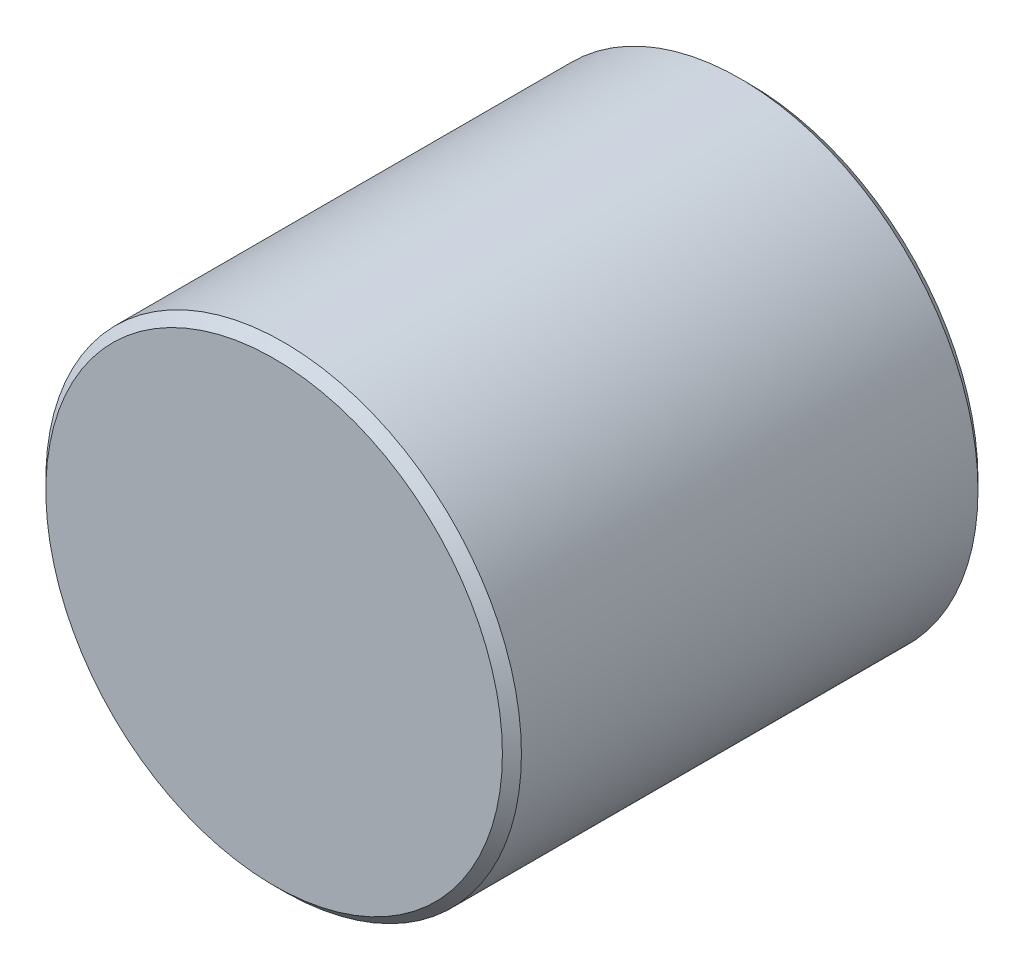
ISO-10303-21;
HEADER;
FILE_DESCRIPTION(('STEP AP214'),'2;1');
FILE_NAME('part.step','',(''),(''),'','','');
FILE_SCHEMA(('AUTOMOTIVE_DESIGN { 1 0 10303 214 1 1 1 1 }'));
ENDSEC;
DATA;
#1=APPLICATION_CONTEXT('core data for automotive mechanical design processes');
#2=APPLICATION_PROTOCOL_DEFINITION('international standard','automotive_design',2000,#1);
#3=PRODUCT_CONTEXT('',#1,'mechanical');
#4=PRODUCT('Part','Part','',(#3));
#5=PRODUCT_RELATED_PRODUCT_CATEGORY('part','',(#4));
#6=PRODUCT_DEFINITION_FORMATION('','',#4);
#7=PRODUCT_DEFINITION_CONTEXT('part definition',#1,'design');
#8=PRODUCT_DEFINITION('design','',#6,#7);
#9=PRODUCT_DEFINITION_SHAPE('','',#8);
#10=(LENGTH_UNIT() NAMED_UNIT(*) SI_UNIT(.MILLI.,.METRE.));
#11=(NAMED_UNIT(*) PLANE_ANGLE_UNIT() SI_UNIT($,.RADIAN.));
#12=(NAMED_UNIT(*) SI_UNIT($,.STERADIAN.) SOLID_ANGLE_UNIT());
#13=UNCERTAINTY_MEASURE_WITH_UNIT(LENGTH_MEASURE(1.E-05),#10,'distance_accuracy_value','');
#14=(GEOMETRIC_REPRESENTATION_CONTEXT(3) GLOBAL_UNCERTAINTY_ASSIGNED_CONTEXT((#13)) GLOBAL_UNIT_ASSIGNED_CONTEXT((#10,
#11,#12)) REPRESENTATION_CONTEXT('',''));
#15=CARTESIAN_POINT('',(0.,0.,0.));
#16=DIRECTION('',(0.,0.,1.));
#17=DIRECTION('',(1.,0.,0.));
#18=AXIS2_PLACEMENT_3D('',#15,#16,#17);
#19=CARTESIAN_POINT('',(0.,0.,5.));
#20=DIRECTION('',(0.,0.,-1.));
#21=DIRECTION('',(-1.,0.,0.));
#22=AXIS2_PLACEMENT_3D('',#19,#20,#21);
#23=CYLINDRICAL_SURFACE('',#22,2.5);
#24=CARTESIAN_POINT('',(0.,0.,0.0999999999999985));
#25=DIRECTION('',(0.,0.,1.));
#26=DIRECTION('',(1.,0.,0.));
#27=AXIS2_PLACEMENT_3D('',#24,#25,#26);
#28=CIRCLE('',#27,2.5);
#29=CARTESIAN_POINT('',(2.5,0.,0.0999999999999985));
#30=VERTEX_POINT('',#29);
#31=EDGE_CURVE('E57',#30,#30,#28,.T.);
#32=ORIENTED_EDGE('',*,*,#31,.T.);
#33=EDGE_LOOP('',(#32));
#34=FACE_BOUND('',#33,.T.);
#35=CARTESIAN_POINT('',(0.,0.,4.9));
#36=DIRECTION('',(0.,0.,1.));
#37=DIRECTION('',(1.,0.,0.));
#38=AXIS2_PLACEMENT_3D('',#35,#36,#37);
#39=CIRCLE('',#38,2.5);
#40=CARTESIAN_POINT('',(2.5,0.,4.9));
#41=VERTEX_POINT('',#40);
#42=EDGE_CURVE('E62',#41,#41,#39,.F.);
#43=ORIENTED_EDGE('',*,*,#42,.T.);
#44=EDGE_LOOP('',(#43));
#45=FACE_BOUND('',#44,.T.);
#46=ADVANCED_FACE('F43',(#34,#45),#23,.T.);
#47=CARTESIAN_POINT('',(0.,0.,5.));
#48=DIRECTION('',(0.,0.,1.));
#49=DIRECTION('',(1.,0.,0.));
#50=AXIS2_PLACEMENT_3D('',#47,#48,#49);
#51=PLANE('',#50);
#52=CARTESIAN_POINT('',(0.,0.,5.));
#53=DIRECTION('',(0.,0.,1.));
#54=DIRECTION('',(1.,0.,0.));
#55=AXIS2_PLACEMENT_3D('',#52,#53,#54);
#56=CIRCLE('',#55,2.4);
#57=CARTESIAN_POINT('',(2.4,0.,5.));
#58=VERTEX_POINT('',#57);
#59=EDGE_CURVE('E10',#58,#58,#56,.T.);
#60=ORIENTED_EDGE('',*,*,#59,.T.);
#61=EDGE_LOOP('',(#60));
#62=FACE_BOUND('',#61,.T.);
#63=ADVANCED_FACE('F79',(#62),#51,.T.);
#64=CARTESIAN_POINT('',(0.,0.,0.));
#65=DIRECTION('',(0.,0.,1.));
#66=DIRECTION('',(1.,0.,0.));
#67=AXIS2_PLACEMENT_3D('',#64,#65,#66);
#68=PLANE('',#67);
#69=CARTESIAN_POINT('',(0.,0.,0.));
#70=DIRECTION('',(0.,0.,1.));
#71=DIRECTION('',(1.,0.,0.));
#72=AXIS2_PLACEMENT_3D('',#69,#70,#71);
#73=CIRCLE('',#72,2.4);
#74=CARTESIAN_POINT('',(2.4,0.,0.));
#75=VERTEX_POINT('',#74);
#76=EDGE_CURVE('E52',#75,#75,#73,.F.);
#77=ORIENTED_EDGE('',*,*,#76,.T.);
#78=EDGE_LOOP('',(#77));
#79=FACE_BOUND('',#78,.T.);
#80=ADVANCED_FACE('F76',(#79),#68,.F.);
#81=CARTESIAN_POINT('',(0.,0.,0.0999999999999985));
#82=DIRECTION('',(0.,0.,1.));
#83=DIRECTION('',(1.,0.,0.));
#84=AXIS2_PLACEMENT_3D('',#81,#82,#83);
#85=CONICAL_SURFACE('',#84,2.5,0.78539816339745);
#86=ORIENTED_EDGE('',*,*,#76,.F.);
#87=EDGE_LOOP('',(#86));
#88=FACE_BOUND('',#87,.T.);
#89=ORIENTED_EDGE('',*,*,#31,.F.);
#90=EDGE_LOOP('',(#89));
#91=FACE_BOUND('',#90,.T.);
#92=ADVANCED_FACE('F72',(#88,#91),#85,.T.);
#93=CARTESIAN_POINT('',(0.,0.,5.));
#94=DIRECTION('',(0.,0.,-1.));
#95=DIRECTION('',(-1.,0.,0.));
#96=AXIS2_PLACEMENT_3D('',#93,#94,#95);
#97=CONICAL_SURFACE('',#96,2.4,0.785398163397442);
#98=ORIENTED_EDGE('',*,*,#42,.F.);
#99=EDGE_LOOP('',(#98));
#100=FACE_BOUND('',#99,.T.);
#101=ORIENTED_EDGE('',*,*,#59,.F.);
#102=EDGE_LOOP('',(#101));
#103=FACE_BOUND('',#102,.T.);
#104=ADVANCED_FACE('F46',(#100,#103),#97,.T.);
#105=CLOSED_SHELL('',(#46,#63,#80,#92,#104));
#106=MANIFOLD_SOLID_BREP('B2',#105);
#107=ADVANCED_BREP_SHAPE_REPRESENTATION('',(#18,#106),#14);
#108=SHAPE_DEFINITION_REPRESENTATION(#9,#107);
ENDSEC;
END-ISO-10303-21;
